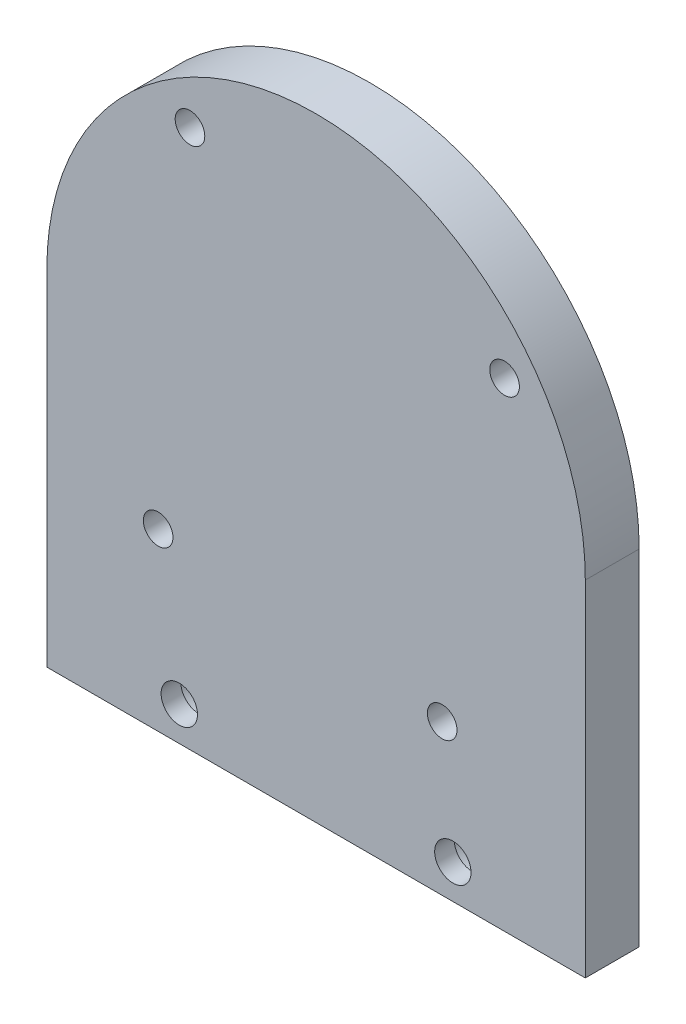
ISO-10303-21;
HEADER;
FILE_DESCRIPTION(('STEP AP214'),'2;1');
FILE_NAME('part.step','',(''),(''),'','','');
FILE_SCHEMA(('AUTOMOTIVE_DESIGN { 1 0 10303 214 1 1 1 1 }'));
ENDSEC;
DATA;
#1=APPLICATION_CONTEXT('core data for automotive mechanical design processes');
#2=APPLICATION_PROTOCOL_DEFINITION('international standard','automotive_design',2000,#1);
#3=PRODUCT_CONTEXT('',#1,'mechanical');
#4=PRODUCT('Part','Part','',(#3));
#5=PRODUCT_RELATED_PRODUCT_CATEGORY('part','',(#4));
#6=PRODUCT_DEFINITION_FORMATION('','',#4);
#7=PRODUCT_DEFINITION_CONTEXT('part definition',#1,'design');
#8=PRODUCT_DEFINITION('design','',#6,#7);
#9=PRODUCT_DEFINITION_SHAPE('','',#8);
#10=(LENGTH_UNIT() NAMED_UNIT(*) SI_UNIT(.MILLI.,.METRE.));
#11=(NAMED_UNIT(*) PLANE_ANGLE_UNIT() SI_UNIT($,.RADIAN.));
#12=(NAMED_UNIT(*) SI_UNIT($,.STERADIAN.) SOLID_ANGLE_UNIT());
#13=UNCERTAINTY_MEASURE_WITH_UNIT(LENGTH_MEASURE(1.E-05),#10,'distance_accuracy_value','');
#14=(GEOMETRIC_REPRESENTATION_CONTEXT(3) GLOBAL_UNCERTAINTY_ASSIGNED_CONTEXT((#13)) GLOBAL_UNIT_ASSIGNED_CONTEXT((#10,
#11,#12)) REPRESENTATION_CONTEXT('',''));
#15=CARTESIAN_POINT('',(0.,0.,0.));
#16=DIRECTION('',(0.,0.,1.));
#17=DIRECTION('',(1.,0.,0.));
#18=AXIS2_PLACEMENT_3D('',#15,#16,#17);
#19=CARTESIAN_POINT('',(50.,0.,10.));
#20=DIRECTION('',(1.,0.,0.));
#21=DIRECTION('',(0.,1.,0.));
#22=AXIS2_PLACEMENT_3D('',#19,#20,#21);
#23=PLANE('',#22);
#24=DIRECTION('',(0.,-1.,0.));
#25=VECTOR('',#24,1.);
#26=CARTESIAN_POINT('',(50.,0.,0.));
#27=LINE('',#26,#25);
#28=CARTESIAN_POINT('',(50.,0.,0.));
#29=VERTEX_POINT('',#28);
#30=CARTESIAN_POINT('',(50.,-64.,0.));
#31=VERTEX_POINT('',#30);
#32=EDGE_CURVE('E129',#29,#31,#27,.T.);
#33=ORIENTED_EDGE('',*,*,#32,.F.);
#34=DIRECTION('',(0.,0.,-1.));
#35=VECTOR('',#34,1.);
#36=CARTESIAN_POINT('',(50.,0.,10.));
#37=LINE('',#36,#35);
#38=CARTESIAN_POINT('',(50.,0.,10.));
#39=VERTEX_POINT('',#38);
#40=EDGE_CURVE('E11',#39,#29,#37,.T.);
#41=ORIENTED_EDGE('',*,*,#40,.F.);
#42=DIRECTION('',(0.,-1.,0.));
#43=VECTOR('',#42,1.);
#44=CARTESIAN_POINT('',(50.,0.,10.));
#45=LINE('',#44,#43);
#46=CARTESIAN_POINT('',(50.,-64.,10.));
#47=VERTEX_POINT('',#46);
#48=EDGE_CURVE('E108',#39,#47,#45,.T.);
#49=ORIENTED_EDGE('',*,*,#48,.T.);
#50=DIRECTION('',(0.,0.,-1.));
#51=VECTOR('',#50,1.);
#52=CARTESIAN_POINT('',(50.,-64.,10.));
#53=LINE('',#52,#51);
#54=EDGE_CURVE('E71',#47,#31,#53,.T.);
#55=ORIENTED_EDGE('',*,*,#54,.T.);
#56=EDGE_LOOP('',(#33,#41,#49,#55));
#57=FACE_BOUND('',#56,.T.);
#58=ADVANCED_FACE('F51',(#57),#23,.T.);
#59=CARTESIAN_POINT('',(0.,0.,10.));
#60=DIRECTION('',(0.,0.,-1.));
#61=DIRECTION('',(-1.,0.,0.));
#62=AXIS2_PLACEMENT_3D('',#59,#60,#61);
#63=CYLINDRICAL_SURFACE('',#62,50.);
#64=CARTESIAN_POINT('',(0.,0.,0.));
#65=DIRECTION('',(0.,0.,1.));
#66=DIRECTION('',(1.,0.,0.));
#67=AXIS2_PLACEMENT_3D('',#64,#65,#66);
#68=CIRCLE('',#67,50.);
#69=CARTESIAN_POINT('',(-50.,0.,0.));
#70=VERTEX_POINT('',#69);
#71=EDGE_CURVE('E115',#29,#70,#68,.T.);
#72=ORIENTED_EDGE('',*,*,#71,.T.);
#73=DIRECTION('',(0.,0.,-1.));
#74=VECTOR('',#73,1.);
#75=CARTESIAN_POINT('',(-50.,0.,10.));
#76=LINE('',#75,#74);
#77=CARTESIAN_POINT('',(-50.,0.,10.));
#78=VERTEX_POINT('',#77);
#79=EDGE_CURVE('E60',#78,#70,#76,.T.);
#80=ORIENTED_EDGE('',*,*,#79,.F.);
#81=CARTESIAN_POINT('',(0.,0.,10.));
#82=DIRECTION('',(0.,0.,1.));
#83=DIRECTION('',(1.,0.,0.));
#84=AXIS2_PLACEMENT_3D('',#81,#82,#83);
#85=CIRCLE('',#84,50.);
#86=EDGE_CURVE('E102',#39,#78,#85,.T.);
#87=ORIENTED_EDGE('',*,*,#86,.F.);
#88=ORIENTED_EDGE('',*,*,#40,.T.);
#89=EDGE_LOOP('',(#72,#80,#87,#88));
#90=FACE_BOUND('',#89,.T.);
#91=ADVANCED_FACE('F113',(#90),#63,.T.);
#92=CARTESIAN_POINT('',(-50.,0.,10.));
#93=DIRECTION('',(1.,0.,0.));
#94=DIRECTION('',(0.,1.,0.));
#95=AXIS2_PLACEMENT_3D('',#92,#93,#94);
#96=PLANE('',#95);
#97=DIRECTION('',(0.,-1.,0.));
#98=VECTOR('',#97,1.);
#99=CARTESIAN_POINT('',(-50.,0.,0.));
#100=LINE('',#99,#98);
#101=CARTESIAN_POINT('',(-50.,-64.,0.));
#102=VERTEX_POINT('',#101);
#103=EDGE_CURVE('E135',#70,#102,#100,.T.);
#104=ORIENTED_EDGE('',*,*,#103,.T.);
#105=DIRECTION('',(0.,0.,-1.));
#106=VECTOR('',#105,1.);
#107=CARTESIAN_POINT('',(-50.,-64.,10.));
#108=LINE('',#107,#106);
#109=CARTESIAN_POINT('',(-50.,-64.,10.));
#110=VERTEX_POINT('',#109);
#111=EDGE_CURVE('E90',#110,#102,#108,.T.);
#112=ORIENTED_EDGE('',*,*,#111,.F.);
#113=DIRECTION('',(0.,-1.,0.));
#114=VECTOR('',#113,1.);
#115=CARTESIAN_POINT('',(-50.,0.,10.));
#116=LINE('',#115,#114);
#117=EDGE_CURVE('E107',#78,#110,#116,.T.);
#118=ORIENTED_EDGE('',*,*,#117,.F.);
#119=ORIENTED_EDGE('',*,*,#79,.T.);
#120=EDGE_LOOP('',(#104,#112,#118,#119));
#121=FACE_BOUND('',#120,.T.);
#122=ADVANCED_FACE('F119',(#121),#96,.F.);
#123=CARTESIAN_POINT('',(0.,-64.,10.));
#124=DIRECTION('',(0.,-1.,0.));
#125=DIRECTION('',(0.,0.,-1.));
#126=AXIS2_PLACEMENT_3D('',#123,#124,#125);
#127=PLANE('',#126);
#128=DIRECTION('',(-1.,0.,0.));
#129=VECTOR('',#128,1.);
#130=CARTESIAN_POINT('',(0.,-64.,0.));
#131=LINE('',#130,#129);
#132=EDGE_CURVE('E138',#31,#102,#131,.T.);
#133=ORIENTED_EDGE('',*,*,#132,.F.);
#134=ORIENTED_EDGE('',*,*,#54,.F.);
#135=DIRECTION('',(-1.,0.,0.));
#136=VECTOR('',#135,1.);
#137=CARTESIAN_POINT('',(0.,-64.,10.));
#138=LINE('',#137,#136);
#139=EDGE_CURVE('E121',#47,#110,#138,.T.);
#140=ORIENTED_EDGE('',*,*,#139,.T.);
#141=ORIENTED_EDGE('',*,*,#111,.T.);
#142=EDGE_LOOP('',(#133,#134,#140,#141));
#143=FACE_BOUND('',#142,.T.);
#144=ADVANCED_FACE('F311',(#143),#127,.T.);
#145=CARTESIAN_POINT('',(0.,0.,10.));
#146=DIRECTION('',(0.,0.,1.));
#147=DIRECTION('',(1.,0.,0.));
#148=AXIS2_PLACEMENT_3D('',#145,#146,#147);
#149=PLANE('',#148);
#150=CARTESIAN_POINT('',(25.4,-57.65,10.));
#151=DIRECTION('',(0.,0.,1.));
#152=DIRECTION('',(1.,0.,0.));
#153=AXIS2_PLACEMENT_3D('',#150,#151,#152);
#154=CIRCLE('',#153,3.3782);
#155=CARTESIAN_POINT('',(28.7782,-57.65,10.));
#156=VERTEX_POINT('',#155);
#157=EDGE_CURVE('E160',#156,#156,#154,.T.);
#158=ORIENTED_EDGE('',*,*,#157,.F.);
#159=EDGE_LOOP('',(#158));
#160=FACE_BOUND('',#159,.T.);
#161=CARTESIAN_POINT('',(-25.4,-57.65,10.));
#162=DIRECTION('',(0.,0.,1.));
#163=DIRECTION('',(1.,0.,0.));
#164=AXIS2_PLACEMENT_3D('',#161,#162,#163);
#165=CIRCLE('',#164,3.3782);
#166=CARTESIAN_POINT('',(-22.0218,-57.65,10.));
#167=VERTEX_POINT('',#166);
#168=EDGE_CURVE('E182',#167,#167,#165,.T.);
#169=ORIENTED_EDGE('',*,*,#168,.F.);
#170=EDGE_LOOP('',(#169));
#171=FACE_BOUND('',#170,.T.);
#172=CARTESIAN_POINT('',(35.0069672893218,24.9702270955703,10.));
#173=DIRECTION('',(0.,0.,1.));
#174=DIRECTION('',(1.,0.,0.));
#175=AXIS2_PLACEMENT_3D('',#172,#173,#174);
#176=CIRCLE('',#175,2.75);
#177=CARTESIAN_POINT('',(37.7569672893218,24.9702270955703,10.));
#178=VERTEX_POINT('',#177);
#179=EDGE_CURVE('E234',#178,#178,#176,.T.);
#180=ORIENTED_EDGE('',*,*,#179,.F.);
#181=EDGE_LOOP('',(#180));
#182=FACE_BOUND('',#181,.T.);
#183=CARTESIAN_POINT('',(23.4194785056462,-36.0628344216532,10.));
#184=DIRECTION('',(0.,0.,1.));
#185=DIRECTION('',(1.,0.,0.));
#186=AXIS2_PLACEMENT_3D('',#183,#184,#185);
#187=CIRCLE('',#186,2.75);
#188=CARTESIAN_POINT('',(26.1694785056462,-36.0628344216532,10.));
#189=VERTEX_POINT('',#188);
#190=EDGE_CURVE('E210',#189,#189,#187,.T.);
#191=ORIENTED_EDGE('',*,*,#190,.F.);
#192=EDGE_LOOP('',(#191));
#193=FACE_BOUND('',#192,.T.);
#194=CARTESIAN_POINT('',(-29.3259294826875,-31.4482091696243,10.));
#195=DIRECTION('',(0.,0.,1.));
#196=DIRECTION('',(1.,0.,0.));
#197=AXIS2_PLACEMENT_3D('',#194,#195,#196);
#198=CIRCLE('',#197,2.75);
#199=CARTESIAN_POINT('',(-26.5759294826875,-31.4482091696243,10.));
#200=VERTEX_POINT('',#199);
#201=EDGE_CURVE('E279',#200,#200,#198,.T.);
#202=ORIENTED_EDGE('',*,*,#201,.F.);
#203=EDGE_LOOP('',(#202));
#204=FACE_BOUND('',#203,.T.);
#205=CARTESIAN_POINT('',(-23.4194785056462,36.0628344216532,10.));
#206=DIRECTION('',(0.,0.,1.));
#207=DIRECTION('',(1.,0.,0.));
#208=AXIS2_PLACEMENT_3D('',#205,#206,#207);
#209=CIRCLE('',#208,2.75);
#210=CARTESIAN_POINT('',(-20.6694785056462,36.0628344216532,10.));
#211=VERTEX_POINT('',#210);
#212=EDGE_CURVE('E132',#211,#211,#209,.T.);
#213=ORIENTED_EDGE('',*,*,#212,.F.);
#214=EDGE_LOOP('',(#213));
#215=FACE_BOUND('',#214,.T.);
#216=ORIENTED_EDGE('',*,*,#48,.F.);
#217=ORIENTED_EDGE('',*,*,#86,.T.);
#218=ORIENTED_EDGE('',*,*,#117,.T.);
#219=ORIENTED_EDGE('',*,*,#139,.F.);
#220=EDGE_LOOP('',(#216,#217,#218,#219));
#221=FACE_BOUND('',#220,.T.);
#222=ADVANCED_FACE('F104',(#160,#171,#182,#193,#204,#215,#221),#149,.T.);
#223=CARTESIAN_POINT('',(0.,0.,0.));
#224=DIRECTION('',(0.,0.,1.));
#225=DIRECTION('',(1.,0.,0.));
#226=AXIS2_PLACEMENT_3D('',#223,#224,#225);
#227=PLANE('',#226);
#228=CARTESIAN_POINT('',(25.4,-57.65,0.));
#229=DIRECTION('',(0.,0.,-1.));
#230=DIRECTION('',(-1.,0.,0.));
#231=AXIS2_PLACEMENT_3D('',#228,#229,#230);
#232=CIRCLE('',#231,5.55625);
#233=CARTESIAN_POINT('',(19.84375,-57.65,0.));
#234=VERTEX_POINT('',#233);
#235=EDGE_CURVE('E178',#234,#234,#232,.T.);
#236=ORIENTED_EDGE('',*,*,#235,.F.);
#237=EDGE_LOOP('',(#236));
#238=FACE_BOUND('',#237,.T.);
#239=CARTESIAN_POINT('',(-25.4,-57.65,0.));
#240=DIRECTION('',(0.,0.,-1.));
#241=DIRECTION('',(-1.,0.,0.));
#242=AXIS2_PLACEMENT_3D('',#239,#240,#241);
#243=CIRCLE('',#242,5.55625);
#244=CARTESIAN_POINT('',(-30.95625,-57.65,0.));
#245=VERTEX_POINT('',#244);
#246=EDGE_CURVE('E164',#245,#245,#243,.T.);
#247=ORIENTED_EDGE('',*,*,#246,.F.);
#248=EDGE_LOOP('',(#247));
#249=FACE_BOUND('',#248,.T.);
#250=CARTESIAN_POINT('',(35.0069672893218,24.9702270955703,0.));
#251=DIRECTION('',(0.,0.,-1.));
#252=DIRECTION('',(-1.,0.,0.));
#253=AXIS2_PLACEMENT_3D('',#250,#251,#252);
#254=CIRCLE('',#253,5.);
#255=CARTESIAN_POINT('',(30.0069672893218,24.9702270955703,0.));
#256=VERTEX_POINT('',#255);
#257=EDGE_CURVE('E186',#256,#256,#254,.T.);
#258=ORIENTED_EDGE('',*,*,#257,.F.);
#259=EDGE_LOOP('',(#258));
#260=FACE_BOUND('',#259,.T.);
#261=CARTESIAN_POINT('',(23.4194785056462,-36.0628344216532,0.));
#262=DIRECTION('',(0.,0.,-1.));
#263=DIRECTION('',(-1.,0.,0.));
#264=AXIS2_PLACEMENT_3D('',#261,#262,#263);
#265=CIRCLE('',#264,5.);
#266=CARTESIAN_POINT('',(18.4194785056462,-36.0628344216532,0.));
#267=VERTEX_POINT('',#266);
#268=EDGE_CURVE('E228',#267,#267,#265,.T.);
#269=ORIENTED_EDGE('',*,*,#268,.F.);
#270=EDGE_LOOP('',(#269));
#271=FACE_BOUND('',#270,.T.);
#272=CARTESIAN_POINT('',(-29.3259294826875,-31.4482091696243,0.));
#273=DIRECTION('',(0.,0.,-1.));
#274=DIRECTION('',(-1.,0.,0.));
#275=AXIS2_PLACEMENT_3D('',#272,#273,#274);
#276=CIRCLE('',#275,5.);
#277=CARTESIAN_POINT('',(-34.3259294826875,-31.4482091696243,0.));
#278=VERTEX_POINT('',#277);
#279=EDGE_CURVE('E214',#278,#278,#276,.T.);
#280=ORIENTED_EDGE('',*,*,#279,.F.);
#281=EDGE_LOOP('',(#280));
#282=FACE_BOUND('',#281,.T.);
#283=CARTESIAN_POINT('',(-23.4194785056462,36.0628344216532,0.));
#284=DIRECTION('',(0.,0.,-1.));
#285=DIRECTION('',(-1.,0.,0.));
#286=AXIS2_PLACEMENT_3D('',#283,#284,#285);
#287=CIRCLE('',#286,5.);
#288=CARTESIAN_POINT('',(-28.4194785056462,36.0628344216532,0.));
#289=VERTEX_POINT('',#288);
#290=EDGE_CURVE('E269',#289,#289,#287,.T.);
#291=ORIENTED_EDGE('',*,*,#290,.F.);
#292=EDGE_LOOP('',(#291));
#293=FACE_BOUND('',#292,.T.);
#294=ORIENTED_EDGE('',*,*,#32,.T.);
#295=ORIENTED_EDGE('',*,*,#132,.T.);
#296=ORIENTED_EDGE('',*,*,#103,.F.);
#297=ORIENTED_EDGE('',*,*,#71,.F.);
#298=EDGE_LOOP('',(#294,#295,#296,#297));
#299=FACE_BOUND('',#298,.T.);
#300=ADVANCED_FACE('F318',(#238,#249,#260,#271,#282,#293,#299),#227,.F.);
#301=CARTESIAN_POINT('',(-23.4194785056462,36.0628344216532,0.));
#302=DIRECTION('',(0.,0.,-1.));
#303=DIRECTION('',(-1.,0.,0.));
#304=AXIS2_PLACEMENT_3D('',#301,#302,#303);
#305=CYLINDRICAL_SURFACE('',#304,2.75);
#306=CARTESIAN_POINT('',(-23.4194785056462,36.0628344216532,5.));
#307=DIRECTION('',(0.,0.,-1.));
#308=DIRECTION('',(-1.,0.,0.));
#309=AXIS2_PLACEMENT_3D('',#306,#307,#308);
#310=CIRCLE('',#309,2.75);
#311=CARTESIAN_POINT('',(-26.1694785056462,36.0628344216532,5.));
#312=VERTEX_POINT('',#311);
#313=EDGE_CURVE('E261',#312,#312,#310,.T.);
#314=ORIENTED_EDGE('',*,*,#313,.T.);
#315=EDGE_LOOP('',(#314));
#316=FACE_BOUND('',#315,.T.);
#317=ORIENTED_EDGE('',*,*,#212,.T.);
#318=EDGE_LOOP('',(#317));
#319=FACE_BOUND('',#318,.T.);
#320=ADVANCED_FACE('F335',(#316,#319),#305,.F.);
#321=CARTESIAN_POINT('',(-20.6694785056462,36.0628344216532,5.));
#322=DIRECTION('',(0.,0.,1.));
#323=DIRECTION('',(1.,0.,0.));
#324=AXIS2_PLACEMENT_3D('',#321,#322,#323);
#325=PLANE('',#324);
#326=ORIENTED_EDGE('',*,*,#313,.F.);
#327=EDGE_LOOP('',(#326));
#328=FACE_BOUND('',#327,.T.);
#329=CARTESIAN_POINT('',(-23.4194785056462,36.0628344216532,5.));
#330=DIRECTION('',(0.,0.,-1.));
#331=DIRECTION('',(-1.,0.,0.));
#332=AXIS2_PLACEMENT_3D('',#329,#330,#331);
#333=CIRCLE('',#332,5.);
#334=CARTESIAN_POINT('',(-28.4194785056462,36.0628344216532,5.));
#335=VERTEX_POINT('',#334);
#336=EDGE_CURVE('E265',#335,#335,#333,.T.);
#337=ORIENTED_EDGE('',*,*,#336,.T.);
#338=EDGE_LOOP('',(#337));
#339=FACE_BOUND('',#338,.T.);
#340=ADVANCED_FACE('F331',(#328,#339),#325,.F.);
#341=CARTESIAN_POINT('',(-23.4194785056462,36.0628344216532,0.));
#342=DIRECTION('',(0.,0.,-1.));
#343=DIRECTION('',(-1.,0.,0.));
#344=AXIS2_PLACEMENT_3D('',#341,#342,#343);
#345=CYLINDRICAL_SURFACE('',#344,5.);
#346=ORIENTED_EDGE('',*,*,#336,.F.);
#347=EDGE_LOOP('',(#346));
#348=FACE_BOUND('',#347,.T.);
#349=ORIENTED_EDGE('',*,*,#290,.T.);
#350=EDGE_LOOP('',(#349));
#351=FACE_BOUND('',#350,.T.);
#352=ADVANCED_FACE('F334',(#348,#351),#345,.F.);
#353=CARTESIAN_POINT('',(-29.3259294826875,-31.4482091696243,0.));
#354=DIRECTION('',(0.,0.,-1.));
#355=DIRECTION('',(-1.,0.,0.));
#356=AXIS2_PLACEMENT_3D('',#353,#354,#355);
#357=CYLINDRICAL_SURFACE('',#356,2.75);
#358=CARTESIAN_POINT('',(-29.3259294826875,-31.4482091696243,5.));
#359=DIRECTION('',(0.,0.,-1.));
#360=DIRECTION('',(-1.,0.,0.));
#361=AXIS2_PLACEMENT_3D('',#358,#359,#360);
#362=CIRCLE('',#361,2.75);
#363=CARTESIAN_POINT('',(-32.0759294826875,-31.4482091696243,5.));
#364=VERTEX_POINT('',#363);
#365=EDGE_CURVE('E295',#364,#364,#362,.T.);
#366=ORIENTED_EDGE('',*,*,#365,.T.);
#367=EDGE_LOOP('',(#366));
#368=FACE_BOUND('',#367,.T.);
#369=ORIENTED_EDGE('',*,*,#201,.T.);
#370=EDGE_LOOP('',(#369));
#371=FACE_BOUND('',#370,.T.);
#372=ADVANCED_FACE('F373',(#368,#371),#357,.F.);
#373=CARTESIAN_POINT('',(-26.5759294826875,-31.4482091696243,5.));
#374=DIRECTION('',(0.,0.,1.));
#375=DIRECTION('',(1.,0.,0.));
#376=AXIS2_PLACEMENT_3D('',#373,#374,#375);
#377=PLANE('',#376);
#378=ORIENTED_EDGE('',*,*,#365,.F.);
#379=EDGE_LOOP('',(#378));
#380=FACE_BOUND('',#379,.T.);
#381=CARTESIAN_POINT('',(-29.3259294826875,-31.4482091696243,5.));
#382=DIRECTION('',(0.,0.,-1.));
#383=DIRECTION('',(-1.,0.,0.));
#384=AXIS2_PLACEMENT_3D('',#381,#382,#383);
#385=CIRCLE('',#384,5.);
#386=CARTESIAN_POINT('',(-34.3259294826875,-31.4482091696243,5.));
#387=VERTEX_POINT('',#386);
#388=EDGE_CURVE('E291',#387,#387,#385,.T.);
#389=ORIENTED_EDGE('',*,*,#388,.T.);
#390=EDGE_LOOP('',(#389));
#391=FACE_BOUND('',#390,.T.);
#392=ADVANCED_FACE('F364',(#380,#391),#377,.F.);
#393=CARTESIAN_POINT('',(-29.3259294826875,-31.4482091696243,0.));
#394=DIRECTION('',(0.,0.,-1.));
#395=DIRECTION('',(-1.,0.,0.));
#396=AXIS2_PLACEMENT_3D('',#393,#394,#395);
#397=CYLINDRICAL_SURFACE('',#396,5.);
#398=ORIENTED_EDGE('',*,*,#388,.F.);
#399=EDGE_LOOP('',(#398));
#400=FACE_BOUND('',#399,.T.);
#401=ORIENTED_EDGE('',*,*,#279,.T.);
#402=EDGE_LOOP('',(#401));
#403=FACE_BOUND('',#402,.T.);
#404=ADVANCED_FACE('F352',(#400,#403),#397,.F.);
#405=CARTESIAN_POINT('',(23.4194785056462,-36.0628344216532,0.));
#406=DIRECTION('',(0.,0.,-1.));
#407=DIRECTION('',(-1.,0.,0.));
#408=AXIS2_PLACEMENT_3D('',#405,#406,#407);
#409=CYLINDRICAL_SURFACE('',#408,2.75);
#410=CARTESIAN_POINT('',(23.4194785056462,-36.0628344216532,5.));
#411=DIRECTION('',(0.,0.,-1.));
#412=DIRECTION('',(-1.,0.,0.));
#413=AXIS2_PLACEMENT_3D('',#410,#411,#412);
#414=CIRCLE('',#413,2.75);
#415=CARTESIAN_POINT('',(20.6694785056462,-36.0628344216532,5.));
#416=VERTEX_POINT('',#415);
#417=EDGE_CURVE('E215',#416,#416,#414,.T.);
#418=ORIENTED_EDGE('',*,*,#417,.T.);
#419=EDGE_LOOP('',(#418));
#420=FACE_BOUND('',#419,.T.);
#421=ORIENTED_EDGE('',*,*,#190,.T.);
#422=EDGE_LOOP('',(#421));
#423=FACE_BOUND('',#422,.T.);
#424=ADVANCED_FACE('F345',(#420,#423),#409,.F.);
#425=CARTESIAN_POINT('',(26.1694785056462,-36.0628344216532,5.));
#426=DIRECTION('',(0.,0.,1.));
#427=DIRECTION('',(1.,0.,0.));
#428=AXIS2_PLACEMENT_3D('',#425,#426,#427);
#429=PLANE('',#428);
#430=ORIENTED_EDGE('',*,*,#417,.F.);
#431=EDGE_LOOP('',(#430));
#432=FACE_BOUND('',#431,.T.);
#433=CARTESIAN_POINT('',(23.4194785056462,-36.0628344216532,5.));
#434=DIRECTION('',(0.,0.,-1.));
#435=DIRECTION('',(-1.,0.,0.));
#436=AXIS2_PLACEMENT_3D('',#433,#434,#435);
#437=CIRCLE('',#436,5.);
#438=CARTESIAN_POINT('',(18.4194785056462,-36.0628344216532,5.));
#439=VERTEX_POINT('',#438);
#440=EDGE_CURVE('E222',#439,#439,#437,.T.);
#441=ORIENTED_EDGE('',*,*,#440,.T.);
#442=EDGE_LOOP('',(#441));
#443=FACE_BOUND('',#442,.T.);
#444=ADVANCED_FACE('F342',(#432,#443),#429,.F.);
#445=CARTESIAN_POINT('',(23.4194785056462,-36.0628344216532,0.));
#446=DIRECTION('',(0.,0.,-1.));
#447=DIRECTION('',(-1.,0.,0.));
#448=AXIS2_PLACEMENT_3D('',#445,#446,#447);
#449=CYLINDRICAL_SURFACE('',#448,5.);
#450=ORIENTED_EDGE('',*,*,#440,.F.);
#451=EDGE_LOOP('',(#450));
#452=FACE_BOUND('',#451,.T.);
#453=ORIENTED_EDGE('',*,*,#268,.T.);
#454=EDGE_LOOP('',(#453));
#455=FACE_BOUND('',#454,.T.);
#456=ADVANCED_FACE('F344',(#452,#455),#449,.F.);
#457=CARTESIAN_POINT('',(35.0069672893218,24.9702270955703,0.));
#458=DIRECTION('',(0.,0.,-1.));
#459=DIRECTION('',(-1.,0.,0.));
#460=AXIS2_PLACEMENT_3D('',#457,#458,#459);
#461=CYLINDRICAL_SURFACE('',#460,2.75);
#462=CARTESIAN_POINT('',(35.0069672893218,24.9702270955703,5.));
#463=DIRECTION('',(0.,0.,-1.));
#464=DIRECTION('',(-1.,0.,0.));
#465=AXIS2_PLACEMENT_3D('',#462,#463,#464);
#466=CIRCLE('',#465,2.75);
#467=CARTESIAN_POINT('',(32.2569672893218,24.9702270955703,5.));
#468=VERTEX_POINT('',#467);
#469=EDGE_CURVE('E240',#468,#468,#466,.T.);
#470=ORIENTED_EDGE('',*,*,#469,.T.);
#471=EDGE_LOOP('',(#470));
#472=FACE_BOUND('',#471,.T.);
#473=ORIENTED_EDGE('',*,*,#179,.T.);
#474=EDGE_LOOP('',(#473));
#475=FACE_BOUND('',#474,.T.);
#476=ADVANCED_FACE('F495',(#472,#475),#461,.F.);
#477=CARTESIAN_POINT('',(37.7569672893218,24.9702270955703,5.));
#478=DIRECTION('',(0.,0.,1.));
#479=DIRECTION('',(1.,0.,0.));
#480=AXIS2_PLACEMENT_3D('',#477,#478,#479);
#481=PLANE('',#480);
#482=ORIENTED_EDGE('',*,*,#469,.F.);
#483=EDGE_LOOP('',(#482));
#484=FACE_BOUND('',#483,.T.);
#485=CARTESIAN_POINT('',(35.0069672893218,24.9702270955703,5.));
#486=DIRECTION('',(0.,0.,-1.));
#487=DIRECTION('',(-1.,0.,0.));
#488=AXIS2_PLACEMENT_3D('',#485,#486,#487);
#489=CIRCLE('',#488,5.);
#490=CARTESIAN_POINT('',(30.0069672893218,24.9702270955703,5.));
#491=VERTEX_POINT('',#490);
#492=EDGE_CURVE('E246',#491,#491,#489,.T.);
#493=ORIENTED_EDGE('',*,*,#492,.T.);
#494=EDGE_LOOP('',(#493));
#495=FACE_BOUND('',#494,.T.);
#496=ADVANCED_FACE('F486',(#484,#495),#481,.F.);
#497=CARTESIAN_POINT('',(35.0069672893218,24.9702270955703,0.));
#498=DIRECTION('',(0.,0.,-1.));
#499=DIRECTION('',(-1.,0.,0.));
#500=AXIS2_PLACEMENT_3D('',#497,#498,#499);
#501=CYLINDRICAL_SURFACE('',#500,5.);
#502=ORIENTED_EDGE('',*,*,#492,.F.);
#503=EDGE_LOOP('',(#502));
#504=FACE_BOUND('',#503,.T.);
#505=ORIENTED_EDGE('',*,*,#257,.T.);
#506=EDGE_LOOP('',(#505));
#507=FACE_BOUND('',#506,.T.);
#508=ADVANCED_FACE('F427',(#504,#507),#501,.F.);
#509=CARTESIAN_POINT('',(-25.4,-57.65,0.));
#510=DIRECTION('',(0.,0.,-1.));
#511=DIRECTION('',(-1.,0.,0.));
#512=AXIS2_PLACEMENT_3D('',#509,#510,#511);
#513=CYLINDRICAL_SURFACE('',#512,3.3782);
#514=CARTESIAN_POINT('',(-25.4,-57.65,6.35));
#515=DIRECTION('',(0.,0.,-1.));
#516=DIRECTION('',(-1.,0.,0.));
#517=AXIS2_PLACEMENT_3D('',#514,#515,#516);
#518=CIRCLE('',#517,3.3782);
#519=CARTESIAN_POINT('',(-28.7782,-57.65,6.35));
#520=VERTEX_POINT('',#519);
#521=EDGE_CURVE('E187',#520,#520,#518,.T.);
#522=ORIENTED_EDGE('',*,*,#521,.T.);
#523=EDGE_LOOP('',(#522));
#524=FACE_BOUND('',#523,.T.);
#525=ORIENTED_EDGE('',*,*,#168,.T.);
#526=EDGE_LOOP('',(#525));
#527=FACE_BOUND('',#526,.T.);
#528=ADVANCED_FACE('F422',(#524,#527),#513,.F.);
#529=CARTESIAN_POINT('',(-22.0218,-57.65,6.35));
#530=DIRECTION('',(0.,0.,1.));
#531=DIRECTION('',(1.,0.,0.));
#532=AXIS2_PLACEMENT_3D('',#529,#530,#531);
#533=PLANE('',#532);
#534=ORIENTED_EDGE('',*,*,#521,.F.);
#535=EDGE_LOOP('',(#534));
#536=FACE_BOUND('',#535,.T.);
#537=CARTESIAN_POINT('',(-25.4,-57.65,6.35));
#538=DIRECTION('',(0.,0.,-1.));
#539=DIRECTION('',(-1.,0.,0.));
#540=AXIS2_PLACEMENT_3D('',#537,#538,#539);
#541=CIRCLE('',#540,5.55625);
#542=CARTESIAN_POINT('',(-30.95625,-57.65,6.35));
#543=VERTEX_POINT('',#542);
#544=EDGE_CURVE('E192',#543,#543,#541,.T.);
#545=ORIENTED_EDGE('',*,*,#544,.T.);
#546=EDGE_LOOP('',(#545));
#547=FACE_BOUND('',#546,.T.);
#548=ADVANCED_FACE('F426',(#536,#547),#533,.F.);
#549=CARTESIAN_POINT('',(-25.4,-57.65,0.));
#550=DIRECTION('',(0.,0.,-1.));
#551=DIRECTION('',(-1.,0.,0.));
#552=AXIS2_PLACEMENT_3D('',#549,#550,#551);
#553=CYLINDRICAL_SURFACE('',#552,5.55625);
#554=ORIENTED_EDGE('',*,*,#544,.F.);
#555=EDGE_LOOP('',(#554));
#556=FACE_BOUND('',#555,.T.);
#557=ORIENTED_EDGE('',*,*,#246,.T.);
#558=EDGE_LOOP('',(#557));
#559=FACE_BOUND('',#558,.T.);
#560=ADVANCED_FACE('F437',(#556,#559),#553,.F.);
#561=CARTESIAN_POINT('',(25.4,-57.65,0.));
#562=DIRECTION('',(0.,0.,-1.));
#563=DIRECTION('',(-1.,0.,0.));
#564=AXIS2_PLACEMENT_3D('',#561,#562,#563);
#565=CYLINDRICAL_SURFACE('',#564,3.3782);
#566=CARTESIAN_POINT('',(25.4,-57.65,6.35));
#567=DIRECTION('',(0.,0.,-1.));
#568=DIRECTION('',(-1.,0.,0.));
#569=AXIS2_PLACEMENT_3D('',#566,#567,#568);
#570=CIRCLE('',#569,3.3782);
#571=CARTESIAN_POINT('',(22.0218,-57.65,6.35));
#572=VERTEX_POINT('',#571);
#573=EDGE_CURVE('E165',#572,#572,#570,.T.);
#574=ORIENTED_EDGE('',*,*,#573,.T.);
#575=EDGE_LOOP('',(#574));
#576=FACE_BOUND('',#575,.T.);
#577=ORIENTED_EDGE('',*,*,#157,.T.);
#578=EDGE_LOOP('',(#577));
#579=FACE_BOUND('',#578,.T.);
#580=ADVANCED_FACE('F446',(#576,#579),#565,.F.);
#581=CARTESIAN_POINT('',(28.7782,-57.65,6.35));
#582=DIRECTION('',(0.,0.,1.));
#583=DIRECTION('',(1.,0.,0.));
#584=AXIS2_PLACEMENT_3D('',#581,#582,#583);
#585=PLANE('',#584);
#586=ORIENTED_EDGE('',*,*,#573,.F.);
#587=EDGE_LOOP('',(#586));
#588=FACE_BOUND('',#587,.T.);
#589=CARTESIAN_POINT('',(25.4,-57.65,6.35));
#590=DIRECTION('',(0.,0.,-1.));
#591=DIRECTION('',(-1.,0.,0.));
#592=AXIS2_PLACEMENT_3D('',#589,#590,#591);
#593=CIRCLE('',#592,5.55625);
#594=CARTESIAN_POINT('',(19.84375,-57.65,6.35));
#595=VERTEX_POINT('',#594);
#596=EDGE_CURVE('E172',#595,#595,#593,.T.);
#597=ORIENTED_EDGE('',*,*,#596,.T.);
#598=EDGE_LOOP('',(#597));
#599=FACE_BOUND('',#598,.T.);
#600=ADVANCED_FACE('F455',(#588,#599),#585,.F.);
#601=CARTESIAN_POINT('',(25.4,-57.65,0.));
#602=DIRECTION('',(0.,0.,-1.));
#603=DIRECTION('',(-1.,0.,0.));
#604=AXIS2_PLACEMENT_3D('',#601,#602,#603);
#605=CYLINDRICAL_SURFACE('',#604,5.55625);
#606=ORIENTED_EDGE('',*,*,#596,.F.);
#607=EDGE_LOOP('',(#606));
#608=FACE_BOUND('',#607,.T.);
#609=ORIENTED_EDGE('',*,*,#235,.T.);
#610=EDGE_LOOP('',(#609));
#611=FACE_BOUND('',#610,.T.);
#612=ADVANCED_FACE('F464',(#608,#611),#605,.F.);
#613=CLOSED_SHELL('',(#58,#91,#122,#144,#222,#300,#320,#340,#352,#372,#392,#404,#424,#444,#456,
#476,#496,#508,#528,#548,#560,#580,#600,#612));
#614=MANIFOLD_SOLID_BREP('B2',#613);
#615=ADVANCED_BREP_SHAPE_REPRESENTATION('',(#18,#614),#14);
#616=SHAPE_DEFINITION_REPRESENTATION(#9,#615);
ENDSEC;
END-ISO-10303-21;
